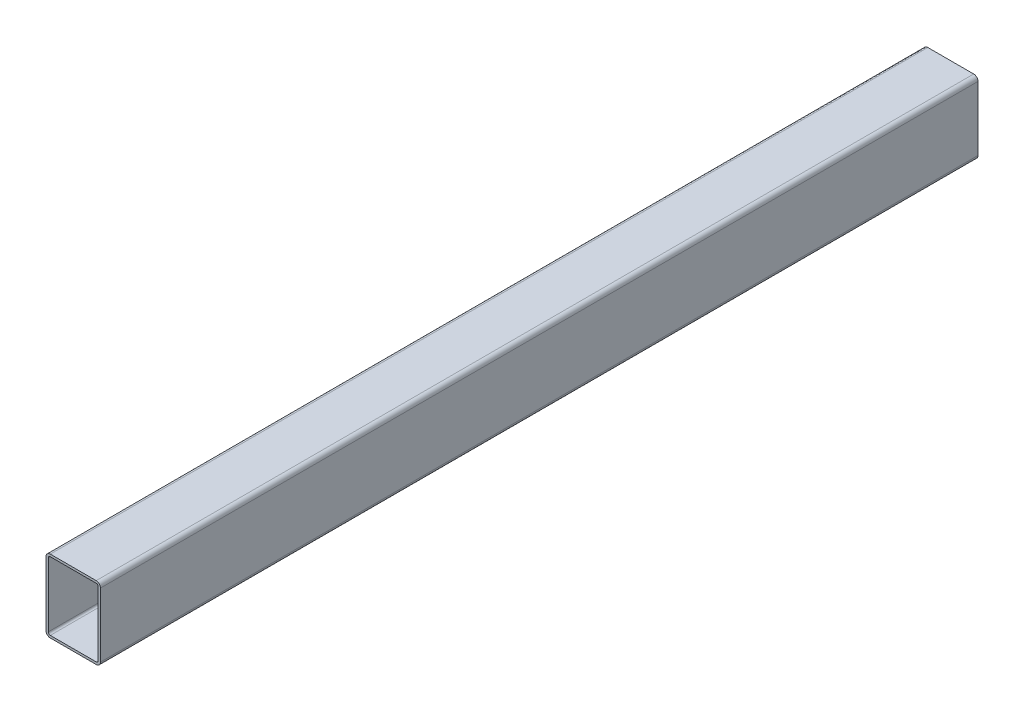
ISO-10303-21;
HEADER;
FILE_DESCRIPTION(('STEP AP214'),'2;1');
FILE_NAME('part.step','',(''),(''),'','','');
FILE_SCHEMA(('AUTOMOTIVE_DESIGN { 1 0 10303 214 1 1 1 1 }'));
ENDSEC;
DATA;
#1=APPLICATION_CONTEXT('core data for automotive mechanical design processes');
#2=APPLICATION_PROTOCOL_DEFINITION('international standard','automotive_design',2000,#1);
#3=PRODUCT_CONTEXT('',#1,'mechanical');
#4=PRODUCT('Part','Part','',(#3));
#5=PRODUCT_RELATED_PRODUCT_CATEGORY('part','',(#4));
#6=PRODUCT_DEFINITION_FORMATION('','',#4);
#7=PRODUCT_DEFINITION_CONTEXT('part definition',#1,'design');
#8=PRODUCT_DEFINITION('design','',#6,#7);
#9=PRODUCT_DEFINITION_SHAPE('','',#8);
#10=(LENGTH_UNIT() NAMED_UNIT(*) SI_UNIT(.MILLI.,.METRE.));
#11=(NAMED_UNIT(*) PLANE_ANGLE_UNIT() SI_UNIT($,.RADIAN.));
#12=(NAMED_UNIT(*) SI_UNIT($,.STERADIAN.) SOLID_ANGLE_UNIT());
#13=UNCERTAINTY_MEASURE_WITH_UNIT(LENGTH_MEASURE(1.E-05),#10,'distance_accuracy_value','');
#14=(GEOMETRIC_REPRESENTATION_CONTEXT(3) GLOBAL_UNCERTAINTY_ASSIGNED_CONTEXT((#13)) GLOBAL_UNIT_ASSIGNED_CONTEXT((#10,
#11,#12)) REPRESENTATION_CONTEXT('',''));
#15=CARTESIAN_POINT('',(0.,0.,0.));
#16=DIRECTION('',(0.,0.,1.));
#17=DIRECTION('',(1.,0.,0.));
#18=AXIS2_PLACEMENT_3D('',#15,#16,#17);
#19=CARTESIAN_POINT('',(-32.1,-44.8,613.5));
#20=DIRECTION('',(0.,0.,-1.));
#21=DIRECTION('',(-1.,0.,0.));
#22=AXIS2_PLACEMENT_3D('',#19,#20,#21);
#23=PLANE('',#22);
#24=CARTESIAN_POINT('',(-32.1,-44.8,613.5));
#25=DIRECTION('',(0.,0.,1.));
#26=DIRECTION('',(-1.,0.,0.));
#27=AXIS2_PLACEMENT_3D('',#24,#25,#26);
#28=CIRCLE('',#27,5.99999999999999);
#29=CARTESIAN_POINT('',(-38.1,-44.8,613.5));
#30=VERTEX_POINT('',#29);
#31=CARTESIAN_POINT('',(-32.1,-50.8,613.5));
#32=VERTEX_POINT('',#31);
#33=EDGE_CURVE('E215',#30,#32,#28,.T.);
#34=ORIENTED_EDGE('',*,*,#33,.T.);
#35=DIRECTION('',(1.,0.,0.));
#36=VECTOR('',#35,1.);
#37=CARTESIAN_POINT('',(32.1,-50.8,613.5));
#38=LINE('',#37,#36);
#39=CARTESIAN_POINT('',(32.1,-50.8,613.5));
#40=VERTEX_POINT('',#39);
#41=EDGE_CURVE('E218',#32,#40,#38,.T.);
#42=ORIENTED_EDGE('',*,*,#41,.T.);
#43=CARTESIAN_POINT('',(32.1,-44.8,613.5));
#44=DIRECTION('',(0.,0.,1.));
#45=DIRECTION('',(1.,0.,0.));
#46=AXIS2_PLACEMENT_3D('',#43,#44,#45);
#47=CIRCLE('',#46,5.99999999999999);
#48=CARTESIAN_POINT('',(38.1,-44.8,613.5));
#49=VERTEX_POINT('',#48);
#50=EDGE_CURVE('E221',#40,#49,#47,.T.);
#51=ORIENTED_EDGE('',*,*,#50,.T.);
#52=DIRECTION('',(0.,1.,0.));
#53=VECTOR('',#52,1.);
#54=CARTESIAN_POINT('',(38.1,-44.8,613.5));
#55=LINE('',#54,#53);
#56=CARTESIAN_POINT('',(38.1,44.8,613.5));
#57=VERTEX_POINT('',#56);
#58=EDGE_CURVE('E223',#49,#57,#55,.T.);
#59=ORIENTED_EDGE('',*,*,#58,.T.);
#60=CARTESIAN_POINT('',(32.1,44.8,613.5));
#61=DIRECTION('',(0.,0.,1.));
#62=DIRECTION('',(1.,0.,0.));
#63=AXIS2_PLACEMENT_3D('',#60,#61,#62);
#64=CIRCLE('',#63,5.99999999999999);
#65=CARTESIAN_POINT('',(32.1,50.8,613.5));
#66=VERTEX_POINT('',#65);
#67=EDGE_CURVE('E225',#57,#66,#64,.T.);
#68=ORIENTED_EDGE('',*,*,#67,.T.);
#69=DIRECTION('',(-1.,0.,0.));
#70=VECTOR('',#69,1.);
#71=CARTESIAN_POINT('',(32.1,50.8,613.5));
#72=LINE('',#71,#70);
#73=CARTESIAN_POINT('',(-32.1,50.8,613.5));
#74=VERTEX_POINT('',#73);
#75=EDGE_CURVE('E227',#66,#74,#72,.T.);
#76=ORIENTED_EDGE('',*,*,#75,.T.);
#77=CARTESIAN_POINT('',(-32.1,44.8,613.5));
#78=DIRECTION('',(0.,0.,1.));
#79=DIRECTION('',(1.,0.,0.));
#80=AXIS2_PLACEMENT_3D('',#77,#78,#79);
#81=CIRCLE('',#80,5.99999999999999);
#82=CARTESIAN_POINT('',(-38.1,44.8,613.5));
#83=VERTEX_POINT('',#82);
#84=EDGE_CURVE('E229',#74,#83,#81,.T.);
#85=ORIENTED_EDGE('',*,*,#84,.T.);
#86=DIRECTION('',(0.,-1.,0.));
#87=VECTOR('',#86,1.);
#88=CARTESIAN_POINT('',(-38.1,-44.8,613.5));
#89=LINE('',#88,#87);
#90=EDGE_CURVE('E231',#83,#30,#89,.T.);
#91=ORIENTED_EDGE('',*,*,#90,.T.);
#92=EDGE_LOOP('',(#34,#42,#51,#59,#68,#76,#85,#91));
#93=FACE_BOUND('',#92,.T.);
#94=CARTESIAN_POINT('',(32.1,44.8,613.5));
#95=DIRECTION('',(0.,0.,1.));
#96=DIRECTION('',(1.,0.,0.));
#97=AXIS2_PLACEMENT_3D('',#94,#95,#96);
#98=CIRCLE('',#97,2.825);
#99=CARTESIAN_POINT('',(34.925,44.8,613.5));
#100=VERTEX_POINT('',#99);
#101=CARTESIAN_POINT('',(32.1,47.625,613.5));
#102=VERTEX_POINT('',#101);
#103=EDGE_CURVE('E150',#100,#102,#98,.T.);
#104=ORIENTED_EDGE('',*,*,#103,.F.);
#105=DIRECTION('',(0.,1.,0.));
#106=VECTOR('',#105,1.);
#107=CARTESIAN_POINT('',(34.925,-44.8,613.5));
#108=LINE('',#107,#106);
#109=CARTESIAN_POINT('',(34.925,-44.8,613.5));
#110=VERTEX_POINT('',#109);
#111=EDGE_CURVE('E183',#110,#100,#108,.T.);
#112=ORIENTED_EDGE('',*,*,#111,.F.);
#113=CARTESIAN_POINT('',(32.1,-44.8,613.5));
#114=DIRECTION('',(0.,0.,1.));
#115=DIRECTION('',(1.,0.,0.));
#116=AXIS2_PLACEMENT_3D('',#113,#114,#115);
#117=CIRCLE('',#116,2.825);
#118=CARTESIAN_POINT('',(32.1,-47.625,613.5));
#119=VERTEX_POINT('',#118);
#120=EDGE_CURVE('E181',#119,#110,#117,.T.);
#121=ORIENTED_EDGE('',*,*,#120,.F.);
#122=DIRECTION('',(1.,0.,0.));
#123=VECTOR('',#122,1.);
#124=CARTESIAN_POINT('',(32.1,-47.625,613.5));
#125=LINE('',#124,#123);
#126=CARTESIAN_POINT('',(-32.1,-47.625,613.5));
#127=VERTEX_POINT('',#126);
#128=EDGE_CURVE('E179',#127,#119,#125,.T.);
#129=ORIENTED_EDGE('',*,*,#128,.F.);
#130=CARTESIAN_POINT('',(-32.1,-44.8,613.5));
#131=DIRECTION('',(0.,0.,1.));
#132=DIRECTION('',(-1.,0.,0.));
#133=AXIS2_PLACEMENT_3D('',#130,#131,#132);
#134=CIRCLE('',#133,2.825);
#135=CARTESIAN_POINT('',(-34.925,-44.8,613.5));
#136=VERTEX_POINT('',#135);
#137=EDGE_CURVE('E177',#136,#127,#134,.T.);
#138=ORIENTED_EDGE('',*,*,#137,.F.);
#139=DIRECTION('',(0.,-1.,0.));
#140=VECTOR('',#139,1.);
#141=CARTESIAN_POINT('',(-34.925,-44.8,613.5));
#142=LINE('',#141,#140);
#143=CARTESIAN_POINT('',(-34.925,44.8,613.5));
#144=VERTEX_POINT('',#143);
#145=EDGE_CURVE('E173',#144,#136,#142,.T.);
#146=ORIENTED_EDGE('',*,*,#145,.F.);
#147=CARTESIAN_POINT('',(-32.1,44.8,613.5));
#148=DIRECTION('',(0.,0.,1.));
#149=DIRECTION('',(1.,0.,0.));
#150=AXIS2_PLACEMENT_3D('',#147,#148,#149);
#151=CIRCLE('',#150,2.825);
#152=CARTESIAN_POINT('',(-32.1,47.625,613.5));
#153=VERTEX_POINT('',#152);
#154=EDGE_CURVE('E171',#153,#144,#151,.T.);
#155=ORIENTED_EDGE('',*,*,#154,.F.);
#156=DIRECTION('',(-1.,0.,0.));
#157=VECTOR('',#156,1.);
#158=CARTESIAN_POINT('',(32.1,47.625,613.5));
#159=LINE('',#158,#157);
#160=EDGE_CURVE('E158',#102,#153,#159,.T.);
#161=ORIENTED_EDGE('',*,*,#160,.F.);
#162=EDGE_LOOP('',(#104,#112,#121,#129,#138,#146,#155,#161));
#163=FACE_BOUND('',#162,.T.);
#164=ADVANCED_FACE('F37',(#93,#163),#23,.F.);
#165=CARTESIAN_POINT('',(-32.1,-44.8,-613.5));
#166=DIRECTION('',(0.,0.,-1.));
#167=DIRECTION('',(-1.,0.,0.));
#168=AXIS2_PLACEMENT_3D('',#165,#166,#167);
#169=PLANE('',#168);
#170=CARTESIAN_POINT('',(-32.1,-44.8,-613.5));
#171=DIRECTION('',(0.,0.,1.));
#172=DIRECTION('',(-1.,0.,0.));
#173=AXIS2_PLACEMENT_3D('',#170,#171,#172);
#174=CIRCLE('',#173,5.99999999999999);
#175=CARTESIAN_POINT('',(-38.1,-44.8,-613.5));
#176=VERTEX_POINT('',#175);
#177=CARTESIAN_POINT('',(-32.1,-50.8,-613.5));
#178=VERTEX_POINT('',#177);
#179=EDGE_CURVE('E166',#176,#178,#174,.T.);
#180=ORIENTED_EDGE('',*,*,#179,.F.);
#181=DIRECTION('',(0.,-1.,0.));
#182=VECTOR('',#181,1.);
#183=CARTESIAN_POINT('',(-38.1,-44.8,-613.5));
#184=LINE('',#183,#182);
#185=CARTESIAN_POINT('',(-38.1,44.8,-613.5));
#186=VERTEX_POINT('',#185);
#187=EDGE_CURVE('E219',#186,#176,#184,.T.);
#188=ORIENTED_EDGE('',*,*,#187,.F.);
#189=CARTESIAN_POINT('',(-32.1,44.8,-613.5));
#190=DIRECTION('',(0.,0.,1.));
#191=DIRECTION('',(1.,0.,0.));
#192=AXIS2_PLACEMENT_3D('',#189,#190,#191);
#193=CIRCLE('',#192,5.99999999999999);
#194=CARTESIAN_POINT('',(-32.1,50.8,-613.5));
#195=VERTEX_POINT('',#194);
#196=EDGE_CURVE('E246',#195,#186,#193,.T.);
#197=ORIENTED_EDGE('',*,*,#196,.F.);
#198=DIRECTION('',(-1.,0.,0.));
#199=VECTOR('',#198,1.);
#200=CARTESIAN_POINT('',(32.1,50.8,-613.5));
#201=LINE('',#200,#199);
#202=CARTESIAN_POINT('',(32.1,50.8,-613.5));
#203=VERTEX_POINT('',#202);
#204=EDGE_CURVE('E244',#203,#195,#201,.T.);
#205=ORIENTED_EDGE('',*,*,#204,.F.);
#206=CARTESIAN_POINT('',(32.1,44.8,-613.5));
#207=DIRECTION('',(0.,0.,1.));
#208=DIRECTION('',(1.,0.,0.));
#209=AXIS2_PLACEMENT_3D('',#206,#207,#208);
#210=CIRCLE('',#209,5.99999999999999);
#211=CARTESIAN_POINT('',(38.1,44.8,-613.5));
#212=VERTEX_POINT('',#211);
#213=EDGE_CURVE('E242',#212,#203,#210,.T.);
#214=ORIENTED_EDGE('',*,*,#213,.F.);
#215=DIRECTION('',(0.,1.,0.));
#216=VECTOR('',#215,1.);
#217=CARTESIAN_POINT('',(38.1,-44.8,-613.5));
#218=LINE('',#217,#216);
#219=CARTESIAN_POINT('',(38.1,-44.8,-613.5));
#220=VERTEX_POINT('',#219);
#221=EDGE_CURVE('E240',#220,#212,#218,.T.);
#222=ORIENTED_EDGE('',*,*,#221,.F.);
#223=CARTESIAN_POINT('',(32.1,-44.8,-613.5));
#224=DIRECTION('',(0.,0.,1.));
#225=DIRECTION('',(1.,0.,0.));
#226=AXIS2_PLACEMENT_3D('',#223,#224,#225);
#227=CIRCLE('',#226,5.99999999999999);
#228=CARTESIAN_POINT('',(32.1,-50.8,-613.5));
#229=VERTEX_POINT('',#228);
#230=EDGE_CURVE('E238',#229,#220,#227,.T.);
#231=ORIENTED_EDGE('',*,*,#230,.F.);
#232=DIRECTION('',(1.,0.,0.));
#233=VECTOR('',#232,1.);
#234=CARTESIAN_POINT('',(32.1,-50.8,-613.5));
#235=LINE('',#234,#233);
#236=EDGE_CURVE('E236',#178,#229,#235,.T.);
#237=ORIENTED_EDGE('',*,*,#236,.F.);
#238=EDGE_LOOP('',(#180,#188,#197,#205,#214,#222,#231,#237));
#239=FACE_BOUND('',#238,.T.);
#240=DIRECTION('',(0.,1.,0.));
#241=VECTOR('',#240,1.);
#242=CARTESIAN_POINT('',(34.925,-44.8,-613.5));
#243=LINE('',#242,#241);
#244=CARTESIAN_POINT('',(34.925,-44.8,-613.5));
#245=VERTEX_POINT('',#244);
#246=CARTESIAN_POINT('',(34.925,44.8,-613.5));
#247=VERTEX_POINT('',#246);
#248=EDGE_CURVE('E159',#245,#247,#243,.T.);
#249=ORIENTED_EDGE('',*,*,#248,.T.);
#250=CARTESIAN_POINT('',(32.1,44.8,-613.5));
#251=DIRECTION('',(0.,0.,1.));
#252=DIRECTION('',(1.,0.,0.));
#253=AXIS2_PLACEMENT_3D('',#250,#251,#252);
#254=CIRCLE('',#253,2.825);
#255=CARTESIAN_POINT('',(32.1,47.625,-613.5));
#256=VERTEX_POINT('',#255);
#257=EDGE_CURVE('E60',#247,#256,#254,.T.);
#258=ORIENTED_EDGE('',*,*,#257,.T.);
#259=DIRECTION('',(-1.,0.,0.));
#260=VECTOR('',#259,1.);
#261=CARTESIAN_POINT('',(32.1,47.625,-613.5));
#262=LINE('',#261,#260);
#263=CARTESIAN_POINT('',(-32.1,47.625,-613.5));
#264=VERTEX_POINT('',#263);
#265=EDGE_CURVE('E165',#256,#264,#262,.T.);
#266=ORIENTED_EDGE('',*,*,#265,.T.);
#267=CARTESIAN_POINT('',(-32.1,44.8,-613.5));
#268=DIRECTION('',(0.,0.,1.));
#269=DIRECTION('',(1.,0.,0.));
#270=AXIS2_PLACEMENT_3D('',#267,#268,#269);
#271=CIRCLE('',#270,2.825);
#272=CARTESIAN_POINT('',(-34.925,44.8,-613.5));
#273=VERTEX_POINT('',#272);
#274=EDGE_CURVE('E187',#264,#273,#271,.T.);
#275=ORIENTED_EDGE('',*,*,#274,.T.);
#276=DIRECTION('',(0.,-1.,0.));
#277=VECTOR('',#276,1.);
#278=CARTESIAN_POINT('',(-34.925,-44.8,-613.5));
#279=LINE('',#278,#277);
#280=CARTESIAN_POINT('',(-34.925,-44.8,-613.5));
#281=VERTEX_POINT('',#280);
#282=EDGE_CURVE('E190',#273,#281,#279,.T.);
#283=ORIENTED_EDGE('',*,*,#282,.T.);
#284=CARTESIAN_POINT('',(-32.1,-44.8,-613.5));
#285=DIRECTION('',(0.,0.,1.));
#286=DIRECTION('',(-1.,0.,0.));
#287=AXIS2_PLACEMENT_3D('',#284,#285,#286);
#288=CIRCLE('',#287,2.825);
#289=CARTESIAN_POINT('',(-32.1,-47.625,-613.5));
#290=VERTEX_POINT('',#289);
#291=EDGE_CURVE('E193',#281,#290,#288,.T.);
#292=ORIENTED_EDGE('',*,*,#291,.T.);
#293=DIRECTION('',(1.,0.,0.));
#294=VECTOR('',#293,1.);
#295=CARTESIAN_POINT('',(32.1,-47.625,-613.5));
#296=LINE('',#295,#294);
#297=CARTESIAN_POINT('',(32.1,-47.625,-613.5));
#298=VERTEX_POINT('',#297);
#299=EDGE_CURVE('E196',#290,#298,#296,.T.);
#300=ORIENTED_EDGE('',*,*,#299,.T.);
#301=CARTESIAN_POINT('',(32.1,-44.8,-613.5));
#302=DIRECTION('',(0.,0.,1.));
#303=DIRECTION('',(1.,0.,0.));
#304=AXIS2_PLACEMENT_3D('',#301,#302,#303);
#305=CIRCLE('',#304,2.825);
#306=EDGE_CURVE('E199',#298,#245,#305,.T.);
#307=ORIENTED_EDGE('',*,*,#306,.T.);
#308=EDGE_LOOP('',(#249,#258,#266,#275,#283,#292,#300,#307));
#309=FACE_BOUND('',#308,.T.);
#310=ADVANCED_FACE('F276',(#239,#309),#169,.T.);
#311=CARTESIAN_POINT('',(-32.1,-44.8,613.5));
#312=DIRECTION('',(0.,0.,-1.));
#313=DIRECTION('',(-1.,0.,0.));
#314=AXIS2_PLACEMENT_3D('',#311,#312,#313);
#315=CYLINDRICAL_SURFACE('',#314,5.99999999999999);
#316=ORIENTED_EDGE('',*,*,#179,.T.);
#317=DIRECTION('',(0.,0.,-1.));
#318=VECTOR('',#317,1.);
#319=CARTESIAN_POINT('',(-32.1,-50.8,613.5));
#320=LINE('',#319,#318);
#321=EDGE_CURVE('E11',#32,#178,#320,.T.);
#322=ORIENTED_EDGE('',*,*,#321,.F.);
#323=ORIENTED_EDGE('',*,*,#33,.F.);
#324=DIRECTION('',(0.,0.,-1.));
#325=VECTOR('',#324,1.);
#326=CARTESIAN_POINT('',(-38.1,-44.8,613.5));
#327=LINE('',#326,#325);
#328=EDGE_CURVE('E233',#30,#176,#327,.T.);
#329=ORIENTED_EDGE('',*,*,#328,.T.);
#330=EDGE_LOOP('',(#316,#322,#323,#329));
#331=FACE_BOUND('',#330,.T.);
#332=ADVANCED_FACE('F39',(#331),#315,.T.);
#333=CARTESIAN_POINT('',(32.1,-50.8,613.5));
#334=DIRECTION('',(0.,1.,0.));
#335=DIRECTION('',(0.,0.,1.));
#336=AXIS2_PLACEMENT_3D('',#333,#334,#335);
#337=PLANE('',#336);
#338=ORIENTED_EDGE('',*,*,#236,.T.);
#339=DIRECTION('',(0.,0.,-1.));
#340=VECTOR('',#339,1.);
#341=CARTESIAN_POINT('',(32.1,-50.8,613.5));
#342=LINE('',#341,#340);
#343=EDGE_CURVE('E45',#40,#229,#342,.T.);
#344=ORIENTED_EDGE('',*,*,#343,.F.);
#345=ORIENTED_EDGE('',*,*,#41,.F.);
#346=ORIENTED_EDGE('',*,*,#321,.T.);
#347=EDGE_LOOP('',(#338,#344,#345,#346));
#348=FACE_BOUND('',#347,.T.);
#349=ADVANCED_FACE('F293',(#348),#337,.F.);
#350=CARTESIAN_POINT('',(32.1,-44.8,613.5));
#351=DIRECTION('',(0.,0.,-1.));
#352=DIRECTION('',(-1.,0.,0.));
#353=AXIS2_PLACEMENT_3D('',#350,#351,#352);
#354=CYLINDRICAL_SURFACE('',#353,5.99999999999999);
#355=ORIENTED_EDGE('',*,*,#230,.T.);
#356=DIRECTION('',(0.,0.,-1.));
#357=VECTOR('',#356,1.);
#358=CARTESIAN_POINT('',(38.1,-44.8,613.5));
#359=LINE('',#358,#357);
#360=EDGE_CURVE('E263',#49,#220,#359,.T.);
#361=ORIENTED_EDGE('',*,*,#360,.F.);
#362=ORIENTED_EDGE('',*,*,#50,.F.);
#363=ORIENTED_EDGE('',*,*,#343,.T.);
#364=EDGE_LOOP('',(#355,#361,#362,#363));
#365=FACE_BOUND('',#364,.T.);
#366=ADVANCED_FACE('F270',(#365),#354,.T.);
#367=CARTESIAN_POINT('',(38.1,-44.8,613.5));
#368=DIRECTION('',(-1.,0.,0.));
#369=DIRECTION('',(0.,0.,1.));
#370=AXIS2_PLACEMENT_3D('',#367,#368,#369);
#371=PLANE('',#370);
#372=ORIENTED_EDGE('',*,*,#221,.T.);
#373=DIRECTION('',(0.,0.,-1.));
#374=VECTOR('',#373,1.);
#375=CARTESIAN_POINT('',(38.1,44.8,613.5));
#376=LINE('',#375,#374);
#377=EDGE_CURVE('E260',#57,#212,#376,.T.);
#378=ORIENTED_EDGE('',*,*,#377,.F.);
#379=ORIENTED_EDGE('',*,*,#58,.F.);
#380=ORIENTED_EDGE('',*,*,#360,.T.);
#381=EDGE_LOOP('',(#372,#378,#379,#380));
#382=FACE_BOUND('',#381,.T.);
#383=ADVANCED_FACE('F282',(#382),#371,.F.);
#384=CARTESIAN_POINT('',(32.1,44.8,613.5));
#385=DIRECTION('',(0.,0.,-1.));
#386=DIRECTION('',(-1.,0.,0.));
#387=AXIS2_PLACEMENT_3D('',#384,#385,#386);
#388=CYLINDRICAL_SURFACE('',#387,5.99999999999999);
#389=ORIENTED_EDGE('',*,*,#213,.T.);
#390=DIRECTION('',(0.,0.,-1.));
#391=VECTOR('',#390,1.);
#392=CARTESIAN_POINT('',(32.1,50.8,613.5));
#393=LINE('',#392,#391);
#394=EDGE_CURVE('E257',#66,#203,#393,.T.);
#395=ORIENTED_EDGE('',*,*,#394,.F.);
#396=ORIENTED_EDGE('',*,*,#67,.F.);
#397=ORIENTED_EDGE('',*,*,#377,.T.);
#398=EDGE_LOOP('',(#389,#395,#396,#397));
#399=FACE_BOUND('',#398,.T.);
#400=ADVANCED_FACE('F286',(#399),#388,.T.);
#401=CARTESIAN_POINT('',(32.1,50.8,613.5));
#402=DIRECTION('',(0.,-1.,0.));
#403=DIRECTION('',(1.,0.,0.));
#404=AXIS2_PLACEMENT_3D('',#401,#402,#403);
#405=PLANE('',#404);
#406=ORIENTED_EDGE('',*,*,#204,.T.);
#407=DIRECTION('',(0.,0.,-1.));
#408=VECTOR('',#407,1.);
#409=CARTESIAN_POINT('',(-32.1,50.8,613.5));
#410=LINE('',#409,#408);
#411=EDGE_CURVE('E254',#74,#195,#410,.T.);
#412=ORIENTED_EDGE('',*,*,#411,.F.);
#413=ORIENTED_EDGE('',*,*,#75,.F.);
#414=ORIENTED_EDGE('',*,*,#394,.T.);
#415=EDGE_LOOP('',(#406,#412,#413,#414));
#416=FACE_BOUND('',#415,.T.);
#417=ADVANCED_FACE('F306',(#416),#405,.F.);
#418=CARTESIAN_POINT('',(-32.1,44.8,613.5));
#419=DIRECTION('',(0.,0.,-1.));
#420=DIRECTION('',(-1.,0.,0.));
#421=AXIS2_PLACEMENT_3D('',#418,#419,#420);
#422=CYLINDRICAL_SURFACE('',#421,5.99999999999999);
#423=ORIENTED_EDGE('',*,*,#196,.T.);
#424=DIRECTION('',(0.,0.,-1.));
#425=VECTOR('',#424,1.);
#426=CARTESIAN_POINT('',(-38.1,44.8,613.5));
#427=LINE('',#426,#425);
#428=EDGE_CURVE('E251',#83,#186,#427,.T.);
#429=ORIENTED_EDGE('',*,*,#428,.F.);
#430=ORIENTED_EDGE('',*,*,#84,.F.);
#431=ORIENTED_EDGE('',*,*,#411,.T.);
#432=EDGE_LOOP('',(#423,#429,#430,#431));
#433=FACE_BOUND('',#432,.T.);
#434=ADVANCED_FACE('F304',(#433),#422,.T.);
#435=CARTESIAN_POINT('',(-38.1,-44.8,613.5));
#436=DIRECTION('',(1.,0.,0.));
#437=DIRECTION('',(0.,0.,-1.));
#438=AXIS2_PLACEMENT_3D('',#435,#436,#437);
#439=PLANE('',#438);
#440=ORIENTED_EDGE('',*,*,#187,.T.);
#441=ORIENTED_EDGE('',*,*,#328,.F.);
#442=ORIENTED_EDGE('',*,*,#90,.F.);
#443=ORIENTED_EDGE('',*,*,#428,.T.);
#444=EDGE_LOOP('',(#440,#441,#442,#443));
#445=FACE_BOUND('',#444,.T.);
#446=ADVANCED_FACE('F299',(#445),#439,.F.);
#447=CARTESIAN_POINT('',(32.1,44.8,613.5));
#448=DIRECTION('',(0.,0.,-1.));
#449=DIRECTION('',(-1.,0.,0.));
#450=AXIS2_PLACEMENT_3D('',#447,#448,#449);
#451=CYLINDRICAL_SURFACE('',#450,2.825);
#452=ORIENTED_EDGE('',*,*,#257,.F.);
#453=DIRECTION('',(0.,0.,-1.));
#454=VECTOR('',#453,1.);
#455=CARTESIAN_POINT('',(34.925,44.8,613.5));
#456=LINE('',#455,#454);
#457=EDGE_CURVE('E154',#100,#247,#456,.T.);
#458=ORIENTED_EDGE('',*,*,#457,.F.);
#459=ORIENTED_EDGE('',*,*,#103,.T.);
#460=DIRECTION('',(0.,0.,-1.));
#461=VECTOR('',#460,1.);
#462=CARTESIAN_POINT('',(32.1,47.625,613.5));
#463=LINE('',#462,#461);
#464=EDGE_CURVE('E153',#102,#256,#463,.T.);
#465=ORIENTED_EDGE('',*,*,#464,.T.);
#466=EDGE_LOOP('',(#452,#458,#459,#465));
#467=FACE_BOUND('',#466,.T.);
#468=ADVANCED_FACE('F152',(#467),#451,.F.);
#469=CARTESIAN_POINT('',(32.1,47.625,613.5));
#470=DIRECTION('',(0.,-1.,0.));
#471=DIRECTION('',(1.,0.,0.));
#472=AXIS2_PLACEMENT_3D('',#469,#470,#471);
#473=PLANE('',#472);
#474=ORIENTED_EDGE('',*,*,#265,.F.);
#475=ORIENTED_EDGE('',*,*,#464,.F.);
#476=ORIENTED_EDGE('',*,*,#160,.T.);
#477=DIRECTION('',(0.,0.,-1.));
#478=VECTOR('',#477,1.);
#479=CARTESIAN_POINT('',(-32.1,47.625,613.5));
#480=LINE('',#479,#478);
#481=EDGE_CURVE('E167',#153,#264,#480,.T.);
#482=ORIENTED_EDGE('',*,*,#481,.T.);
#483=EDGE_LOOP('',(#474,#475,#476,#482));
#484=FACE_BOUND('',#483,.T.);
#485=ADVANCED_FACE('F162',(#484),#473,.T.);
#486=CARTESIAN_POINT('',(-32.1,44.8,613.5));
#487=DIRECTION('',(0.,0.,-1.));
#488=DIRECTION('',(-1.,0.,0.));
#489=AXIS2_PLACEMENT_3D('',#486,#487,#488);
#490=CYLINDRICAL_SURFACE('',#489,2.825);
#491=ORIENTED_EDGE('',*,*,#274,.F.);
#492=ORIENTED_EDGE('',*,*,#481,.F.);
#493=ORIENTED_EDGE('',*,*,#154,.T.);
#494=DIRECTION('',(0.,0.,-1.));
#495=VECTOR('',#494,1.);
#496=CARTESIAN_POINT('',(-34.925,44.8,613.5));
#497=LINE('',#496,#495);
#498=EDGE_CURVE('E212',#144,#273,#497,.T.);
#499=ORIENTED_EDGE('',*,*,#498,.T.);
#500=EDGE_LOOP('',(#491,#492,#493,#499));
#501=FACE_BOUND('',#500,.T.);
#502=ADVANCED_FACE('F331',(#501),#490,.F.);
#503=CARTESIAN_POINT('',(-34.925,-44.8,613.5));
#504=DIRECTION('',(1.,0.,0.));
#505=DIRECTION('',(0.,0.,-1.));
#506=AXIS2_PLACEMENT_3D('',#503,#504,#505);
#507=PLANE('',#506);
#508=ORIENTED_EDGE('',*,*,#282,.F.);
#509=ORIENTED_EDGE('',*,*,#498,.F.);
#510=ORIENTED_EDGE('',*,*,#145,.T.);
#511=DIRECTION('',(0.,0.,-1.));
#512=VECTOR('',#511,1.);
#513=CARTESIAN_POINT('',(-34.925,-44.8,613.5));
#514=LINE('',#513,#512);
#515=EDGE_CURVE('E210',#136,#281,#514,.T.);
#516=ORIENTED_EDGE('',*,*,#515,.T.);
#517=EDGE_LOOP('',(#508,#509,#510,#516));
#518=FACE_BOUND('',#517,.T.);
#519=ADVANCED_FACE('F335',(#518),#507,.T.);
#520=CARTESIAN_POINT('',(-32.1,-44.8,613.5));
#521=DIRECTION('',(0.,0.,-1.));
#522=DIRECTION('',(-1.,0.,0.));
#523=AXIS2_PLACEMENT_3D('',#520,#521,#522);
#524=CYLINDRICAL_SURFACE('',#523,2.825);
#525=ORIENTED_EDGE('',*,*,#291,.F.);
#526=ORIENTED_EDGE('',*,*,#515,.F.);
#527=ORIENTED_EDGE('',*,*,#137,.T.);
#528=DIRECTION('',(0.,0.,-1.));
#529=VECTOR('',#528,1.);
#530=CARTESIAN_POINT('',(-32.1,-47.625,613.5));
#531=LINE('',#530,#529);
#532=EDGE_CURVE('E208',#127,#290,#531,.T.);
#533=ORIENTED_EDGE('',*,*,#532,.T.);
#534=EDGE_LOOP('',(#525,#526,#527,#533));
#535=FACE_BOUND('',#534,.T.);
#536=ADVANCED_FACE('F341',(#535),#524,.F.);
#537=CARTESIAN_POINT('',(32.1,-47.625,613.5));
#538=DIRECTION('',(0.,1.,0.));
#539=DIRECTION('',(-1.,0.,0.));
#540=AXIS2_PLACEMENT_3D('',#537,#538,#539);
#541=PLANE('',#540);
#542=ORIENTED_EDGE('',*,*,#299,.F.);
#543=ORIENTED_EDGE('',*,*,#532,.F.);
#544=ORIENTED_EDGE('',*,*,#128,.T.);
#545=DIRECTION('',(0.,0.,-1.));
#546=VECTOR('',#545,1.);
#547=CARTESIAN_POINT('',(32.1,-47.625,613.5));
#548=LINE('',#547,#546);
#549=EDGE_CURVE('E206',#119,#298,#548,.T.);
#550=ORIENTED_EDGE('',*,*,#549,.T.);
#551=EDGE_LOOP('',(#542,#543,#544,#550));
#552=FACE_BOUND('',#551,.T.);
#553=ADVANCED_FACE('F345',(#552),#541,.T.);
#554=CARTESIAN_POINT('',(32.1,-44.8,613.5));
#555=DIRECTION('',(0.,0.,-1.));
#556=DIRECTION('',(-1.,0.,0.));
#557=AXIS2_PLACEMENT_3D('',#554,#555,#556);
#558=CYLINDRICAL_SURFACE('',#557,2.825);
#559=ORIENTED_EDGE('',*,*,#306,.F.);
#560=ORIENTED_EDGE('',*,*,#549,.F.);
#561=ORIENTED_EDGE('',*,*,#120,.T.);
#562=DIRECTION('',(0.,0.,-1.));
#563=VECTOR('',#562,1.);
#564=CARTESIAN_POINT('',(34.925,-44.8,613.5));
#565=LINE('',#564,#563);
#566=EDGE_CURVE('E52',#110,#245,#565,.T.);
#567=ORIENTED_EDGE('',*,*,#566,.T.);
#568=EDGE_LOOP('',(#559,#560,#561,#567));
#569=FACE_BOUND('',#568,.T.);
#570=ADVANCED_FACE('F349',(#569),#558,.F.);
#571=CARTESIAN_POINT('',(34.925,-44.8,613.5));
#572=DIRECTION('',(-1.,0.,0.));
#573=DIRECTION('',(0.,0.,1.));
#574=AXIS2_PLACEMENT_3D('',#571,#572,#573);
#575=PLANE('',#574);
#576=ORIENTED_EDGE('',*,*,#248,.F.);
#577=ORIENTED_EDGE('',*,*,#566,.F.);
#578=ORIENTED_EDGE('',*,*,#111,.T.);
#579=ORIENTED_EDGE('',*,*,#457,.T.);
#580=EDGE_LOOP('',(#576,#577,#578,#579));
#581=FACE_BOUND('',#580,.T.);
#582=ADVANCED_FACE('F353',(#581),#575,.T.);
#583=CLOSED_SHELL('',(#164,#310,#332,#349,#366,#383,#400,#417,#434,#446,#468,#485,#502,#519,
#536,#553,#570,#582));
#584=MANIFOLD_SOLID_BREP('B2',#583);
#585=ADVANCED_BREP_SHAPE_REPRESENTATION('',(#18,#584),#14);
#586=SHAPE_DEFINITION_REPRESENTATION(#9,#585);
ENDSEC;
END-ISO-10303-21;
